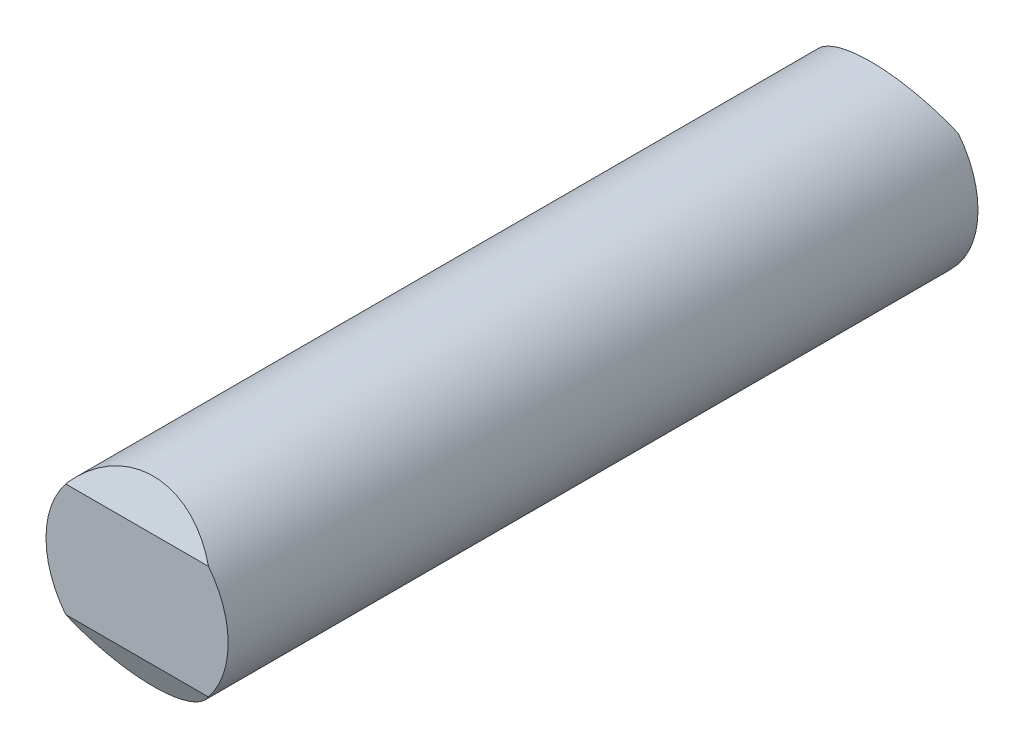
ISO-10303-21;
HEADER;
FILE_DESCRIPTION(('STEP AP214'),'2;1');
FILE_NAME('part.step','',(''),(''),'','','');
FILE_SCHEMA(('AUTOMOTIVE_DESIGN { 1 0 10303 214 1 1 1 1 }'));
ENDSEC;
DATA;
#1=APPLICATION_CONTEXT('core data for automotive mechanical design processes');
#2=APPLICATION_PROTOCOL_DEFINITION('international standard','automotive_design',2000,#1);
#3=PRODUCT_CONTEXT('',#1,'mechanical');
#4=PRODUCT('Part','Part','',(#3));
#5=PRODUCT_RELATED_PRODUCT_CATEGORY('part','',(#4));
#6=PRODUCT_DEFINITION_FORMATION('','',#4);
#7=PRODUCT_DEFINITION_CONTEXT('part definition',#1,'design');
#8=PRODUCT_DEFINITION('design','',#6,#7);
#9=PRODUCT_DEFINITION_SHAPE('','',#8);
#10=(LENGTH_UNIT() NAMED_UNIT(*) SI_UNIT(.MILLI.,.METRE.));
#11=(NAMED_UNIT(*) PLANE_ANGLE_UNIT() SI_UNIT($,.RADIAN.));
#12=(NAMED_UNIT(*) SI_UNIT($,.STERADIAN.) SOLID_ANGLE_UNIT());
#13=UNCERTAINTY_MEASURE_WITH_UNIT(LENGTH_MEASURE(1.E-05),#10,'distance_accuracy_value','');
#14=(GEOMETRIC_REPRESENTATION_CONTEXT(3) GLOBAL_UNCERTAINTY_ASSIGNED_CONTEXT((#13)) GLOBAL_UNIT_ASSIGNED_CONTEXT((#10,
#11,#12)) REPRESENTATION_CONTEXT('',''));
#15=CARTESIAN_POINT('',(0.,0.,0.));
#16=DIRECTION('',(0.,0.,1.));
#17=DIRECTION('',(1.,0.,0.));
#18=AXIS2_PLACEMENT_3D('',#15,#16,#17);
#19=CARTESIAN_POINT('',(26.935,-1.64,-6.46008621971352));
#20=DIRECTION('',(0.,-0.422618261740699,-0.90630778703665));
#21=DIRECTION('',(0.,-0.90630778703665,0.422618261740699));
#22=AXIS2_PLACEMENT_3D('',#19,#20,#21);
#23=PLANE('',#22);
#24=CARTESIAN_POINT('',(28.575,0.,-7.22483077908771));
#25=DIRECTION('',(0.,-0.422618261740699,-0.90630778703665));
#26=DIRECTION('',(0.,0.90630778703665,-0.422618261740699));
#27=AXIS2_PLACEMENT_3D('',#24,#25,#26);
#28=ELLIPSE('',#27,1.80953978709849,1.64);
#29=CARTESIAN_POINT('',(29.8605777436707,-1.01827789182453,-6.75));
#30=VERTEX_POINT('',#29);
#31=CARTESIAN_POINT('',(27.2894222563293,-1.01827789182453,-6.75));
#32=VERTEX_POINT('',#31);
#33=EDGE_CURVE('E74',#30,#32,#28,.T.);
#34=ORIENTED_EDGE('',*,*,#33,.T.);
#35=DIRECTION('',(1.,0.,0.));
#36=VECTOR('',#35,1.);
#37=CARTESIAN_POINT('',(28.575,-1.01827789182455,-6.75));
#38=LINE('',#37,#36);
#39=EDGE_CURVE('E71',#32,#30,#38,.T.);
#40=ORIENTED_EDGE('',*,*,#39,.T.);
#41=EDGE_LOOP('',(#34,#40));
#42=FACE_BOUND('',#41,.T.);
#43=ADVANCED_FACE('F17',(#42),#23,.T.);
#44=CARTESIAN_POINT('',(26.935,1.01827789182439,-6.75));
#45=DIRECTION('',(0.,0.422618261740701,-0.906307787036649));
#46=DIRECTION('',(-1.,0.,0.));
#47=AXIS2_PLACEMENT_3D('',#44,#45,#46);
#48=PLANE('',#47);
#49=CARTESIAN_POINT('',(28.575,0.,-7.22483077908769));
#50=DIRECTION('',(0.,0.422618261740701,-0.906307787036649));
#51=DIRECTION('',(0.,-0.906307787036649,-0.422618261740701));
#52=AXIS2_PLACEMENT_3D('',#49,#50,#51);
#53=ELLIPSE('',#52,1.80953978709849,1.64);
#54=CARTESIAN_POINT('',(27.2894222563293,1.01827789182439,-6.75));
#55=VERTEX_POINT('',#54);
#56=CARTESIAN_POINT('',(29.8605777436707,1.0182778918245,-6.75));
#57=VERTEX_POINT('',#56);
#58=EDGE_CURVE('E85',#55,#57,#53,.T.);
#59=ORIENTED_EDGE('',*,*,#58,.T.);
#60=DIRECTION('',(1.,0.,0.));
#61=VECTOR('',#60,1.);
#62=CARTESIAN_POINT('',(26.935,1.01827789182439,-6.75));
#63=LINE('',#62,#61);
#64=EDGE_CURVE('E64',#55,#57,#63,.T.);
#65=ORIENTED_EDGE('',*,*,#64,.F.);
#66=EDGE_LOOP('',(#59,#65));
#67=FACE_BOUND('',#66,.T.);
#68=ADVANCED_FACE('F127',(#67),#48,.T.);
#69=CARTESIAN_POINT('',(26.935,1.63999999999995,6.46008621971352));
#70=DIRECTION('',(0.,0.422618261740699,0.90630778703665));
#71=DIRECTION('',(1.,0.,0.));
#72=AXIS2_PLACEMENT_3D('',#69,#70,#71);
#73=PLANE('',#72);
#74=CARTESIAN_POINT('',(28.575,0.,7.22483077908769));
#75=DIRECTION('',(0.,0.4226182617407,0.90630778703665));
#76=DIRECTION('',(0.,0.90630778703665,-0.4226182617407));
#77=AXIS2_PLACEMENT_3D('',#74,#75,#76);
#78=ELLIPSE('',#77,1.80953978709849,1.64);
#79=CARTESIAN_POINT('',(29.8605777436708,1.01827789182439,6.75));
#80=VERTEX_POINT('',#79);
#81=CARTESIAN_POINT('',(27.2894222563292,1.01827789182439,6.75));
#82=VERTEX_POINT('',#81);
#83=EDGE_CURVE('E98',#80,#82,#78,.T.);
#84=ORIENTED_EDGE('',*,*,#83,.T.);
#85=DIRECTION('',(1.,0.,0.));
#86=VECTOR('',#85,1.);
#87=CARTESIAN_POINT('',(26.935,1.01827789182439,6.75));
#88=LINE('',#87,#86);
#89=EDGE_CURVE('E11',#82,#80,#88,.T.);
#90=ORIENTED_EDGE('',*,*,#89,.T.);
#91=EDGE_LOOP('',(#84,#90));
#92=FACE_BOUND('',#91,.T.);
#93=ADVANCED_FACE('F120',(#92),#73,.T.);
#94=CARTESIAN_POINT('',(26.935,-1.01827789182453,6.75));
#95=DIRECTION('',(0.,-0.422618261740699,0.90630778703665));
#96=DIRECTION('',(-1.,0.,0.));
#97=AXIS2_PLACEMENT_3D('',#94,#95,#96);
#98=PLANE('',#97);
#99=CARTESIAN_POINT('',(28.575,0.,7.22483077908771));
#100=DIRECTION('',(0.,-0.422618261740699,0.90630778703665));
#101=DIRECTION('',(0.,-0.90630778703665,-0.422618261740699));
#102=AXIS2_PLACEMENT_3D('',#99,#100,#101);
#103=ELLIPSE('',#102,1.80953978709849,1.64);
#104=CARTESIAN_POINT('',(27.2894222563293,-1.01827789182454,6.75));
#105=VERTEX_POINT('',#104);
#106=CARTESIAN_POINT('',(29.8605777436707,-1.01827789182453,6.75));
#107=VERTEX_POINT('',#106);
#108=EDGE_CURVE('E79',#105,#107,#103,.T.);
#109=ORIENTED_EDGE('',*,*,#108,.T.);
#110=DIRECTION('',(1.,0.,0.));
#111=VECTOR('',#110,1.);
#112=CARTESIAN_POINT('',(26.935,-1.01827789182453,6.75));
#113=LINE('',#112,#111);
#114=EDGE_CURVE('E28',#105,#107,#113,.T.);
#115=ORIENTED_EDGE('',*,*,#114,.F.);
#116=EDGE_LOOP('',(#109,#115));
#117=FACE_BOUND('',#116,.T.);
#118=ADVANCED_FACE('F126',(#117),#98,.T.);
#119=CARTESIAN_POINT('',(28.575,0.,6.75));
#120=DIRECTION('',(0.,0.,-1.));
#121=DIRECTION('',(0.,-1.,0.));
#122=AXIS2_PLACEMENT_3D('',#119,#120,#121);
#123=PLANE('',#122);
#124=CARTESIAN_POINT('',(28.575,0.,6.75));
#125=DIRECTION('',(0.,0.,-1.));
#126=DIRECTION('',(1.,0.,0.));
#127=AXIS2_PLACEMENT_3D('',#124,#125,#126);
#128=CIRCLE('',#127,1.64);
#129=EDGE_CURVE('E101',#105,#82,#128,.T.);
#130=ORIENTED_EDGE('',*,*,#129,.F.);
#131=ORIENTED_EDGE('',*,*,#114,.T.);
#132=CARTESIAN_POINT('',(28.575,0.,6.75));
#133=DIRECTION('',(0.,0.,-1.));
#134=DIRECTION('',(1.,0.,0.));
#135=AXIS2_PLACEMENT_3D('',#132,#133,#134);
#136=CIRCLE('',#135,1.64);
#137=EDGE_CURVE('E96',#80,#107,#136,.T.);
#138=ORIENTED_EDGE('',*,*,#137,.F.);
#139=ORIENTED_EDGE('',*,*,#89,.F.);
#140=EDGE_LOOP('',(#130,#131,#138,#139));
#141=FACE_BOUND('',#140,.T.);
#142=ADVANCED_FACE('F118',(#141),#123,.F.);
#143=CARTESIAN_POINT('',(28.575,-1.64,-6.75));
#144=DIRECTION('',(0.,0.,1.));
#145=DIRECTION('',(1.,0.,0.));
#146=AXIS2_PLACEMENT_3D('',#143,#144,#145);
#147=PLANE('',#146);
#148=ORIENTED_EDGE('',*,*,#39,.F.);
#149=CARTESIAN_POINT('',(28.575,0.,-6.75));
#150=DIRECTION('',(0.,0.,-1.));
#151=DIRECTION('',(1.,0.,0.));
#152=AXIS2_PLACEMENT_3D('',#149,#150,#151);
#153=CIRCLE('',#152,1.64);
#154=EDGE_CURVE('E86',#32,#55,#153,.T.);
#155=ORIENTED_EDGE('',*,*,#154,.T.);
#156=ORIENTED_EDGE('',*,*,#64,.T.);
#157=CARTESIAN_POINT('',(28.575,0.,-6.75));
#158=DIRECTION('',(0.,0.,-1.));
#159=DIRECTION('',(1.,0.,0.));
#160=AXIS2_PLACEMENT_3D('',#157,#158,#159);
#161=CIRCLE('',#160,1.64);
#162=EDGE_CURVE('E21',#57,#30,#161,.T.);
#163=ORIENTED_EDGE('',*,*,#162,.T.);
#164=EDGE_LOOP('',(#148,#155,#156,#163));
#165=FACE_BOUND('',#164,.T.);
#166=ADVANCED_FACE('F82',(#165),#147,.F.);
#167=CARTESIAN_POINT('',(28.575,0.,-6.75));
#168=DIRECTION('',(0.,0.,1.));
#169=DIRECTION('',(1.,0.,0.));
#170=AXIS2_PLACEMENT_3D('',#167,#168,#169);
#171=CYLINDRICAL_SURFACE('',#170,1.64);
#172=ORIENTED_EDGE('',*,*,#129,.T.);
#173=ORIENTED_EDGE('',*,*,#83,.F.);
#174=ORIENTED_EDGE('',*,*,#137,.T.);
#175=ORIENTED_EDGE('',*,*,#108,.F.);
#176=EDGE_LOOP('',(#172,#173,#174,#175));
#177=FACE_BOUND('',#176,.T.);
#178=ORIENTED_EDGE('',*,*,#154,.F.);
#179=ORIENTED_EDGE('',*,*,#33,.F.);
#180=ORIENTED_EDGE('',*,*,#162,.F.);
#181=ORIENTED_EDGE('',*,*,#58,.F.);
#182=EDGE_LOOP('',(#178,#179,#180,#181));
#183=FACE_BOUND('',#182,.T.);
#184=ADVANCED_FACE('F19',(#177,#183),#171,.T.);
#185=CLOSED_SHELL('',(#43,#68,#93,#118,#142,#166,#184));
#186=MANIFOLD_SOLID_BREP('B1',#185);
#187=ADVANCED_BREP_SHAPE_REPRESENTATION('',(#18,#186),#14);
#188=SHAPE_DEFINITION_REPRESENTATION(#9,#187);
ENDSEC;
END-ISO-10303-21;
